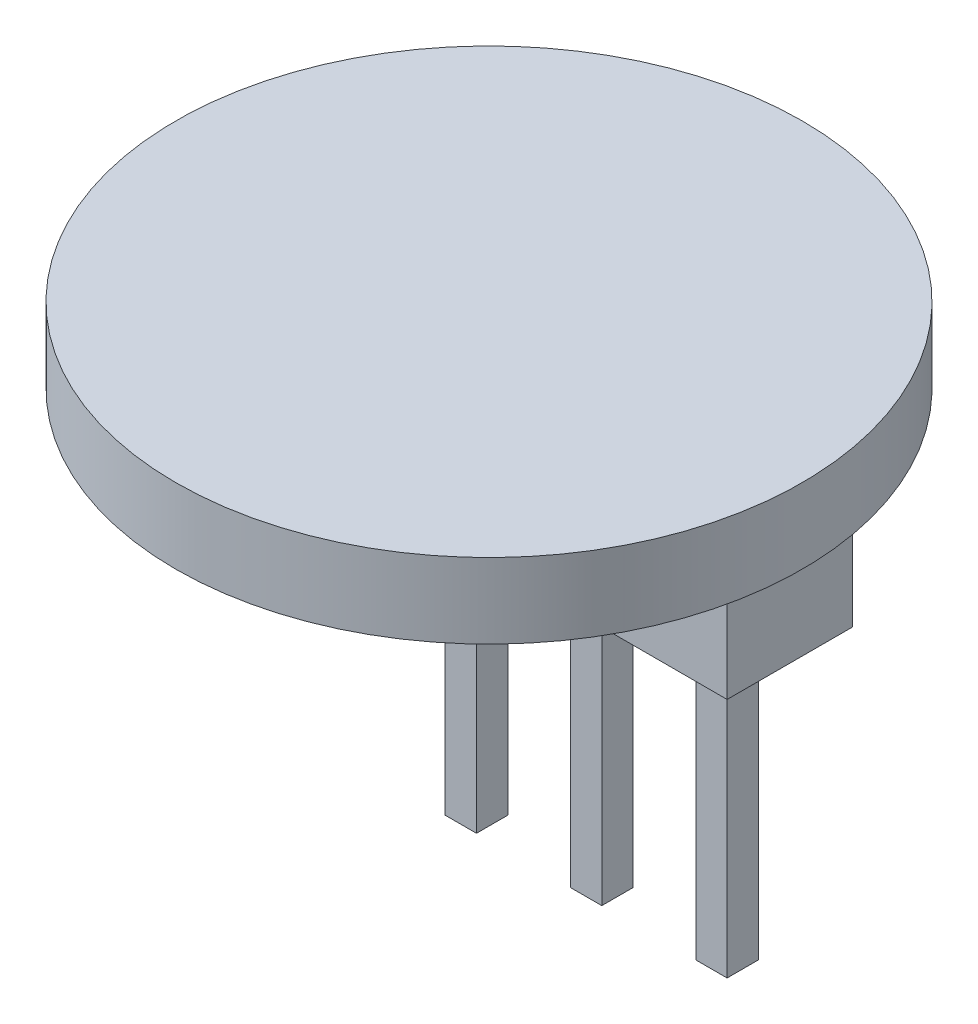
ISO-10303-21;
HEADER;
FILE_DESCRIPTION(('STEP AP214'),'2;1');
FILE_NAME('part.step','',(''),(''),'','','');
FILE_SCHEMA(('AUTOMOTIVE_DESIGN { 1 0 10303 214 1 1 1 1 }'));
ENDSEC;
DATA;
#1=APPLICATION_CONTEXT('core data for automotive mechanical design processes');
#2=APPLICATION_PROTOCOL_DEFINITION('international standard','automotive_design',2000,#1);
#3=PRODUCT_CONTEXT('',#1,'mechanical');
#4=PRODUCT('Part','Part','',(#3));
#5=PRODUCT_RELATED_PRODUCT_CATEGORY('part','',(#4));
#6=PRODUCT_DEFINITION_FORMATION('','',#4);
#7=PRODUCT_DEFINITION_CONTEXT('part definition',#1,'design');
#8=PRODUCT_DEFINITION('design','',#6,#7);
#9=PRODUCT_DEFINITION_SHAPE('','',#8);
#10=(LENGTH_UNIT() NAMED_UNIT(*) SI_UNIT(.MILLI.,.METRE.));
#11=(NAMED_UNIT(*) PLANE_ANGLE_UNIT() SI_UNIT($,.RADIAN.));
#12=(NAMED_UNIT(*) SI_UNIT($,.STERADIAN.) SOLID_ANGLE_UNIT());
#13=UNCERTAINTY_MEASURE_WITH_UNIT(LENGTH_MEASURE(1.E-05),#10,'distance_accuracy_value','');
#14=(GEOMETRIC_REPRESENTATION_CONTEXT(3) GLOBAL_UNCERTAINTY_ASSIGNED_CONTEXT((#13)) GLOBAL_UNIT_ASSIGNED_CONTEXT((#10,
#11,#12)) REPRESENTATION_CONTEXT('',''));
#15=CARTESIAN_POINT('',(0.,0.,0.));
#16=DIRECTION('',(0.,0.,1.));
#17=DIRECTION('',(1.,0.,0.));
#18=AXIS2_PLACEMENT_3D('',#15,#16,#17);
#19=CARTESIAN_POINT('',(0.,-5.584,0.));
#20=DIRECTION('',(0.,-1.,0.));
#21=DIRECTION('',(0.,0.,-1.));
#22=AXIS2_PLACEMENT_3D('',#19,#20,#21);
#23=PLANE('',#22);
#24=DIRECTION('',(-1.,0.,0.));
#25=VECTOR('',#24,1.);
#26=CARTESIAN_POINT('',(-0.317500000000001,-5.584,-1.9685));
#27=LINE('',#26,#25);
#28=CARTESIAN_POINT('',(0.3175,-5.584,-1.9685));
#29=VERTEX_POINT('',#28);
#30=CARTESIAN_POINT('',(-0.317500000000001,-5.584,-1.9685));
#31=VERTEX_POINT('',#30);
#32=EDGE_CURVE('E175',#29,#31,#27,.T.);
#33=ORIENTED_EDGE('',*,*,#32,.F.);
#34=DIRECTION('',(0.,0.,1.));
#35=VECTOR('',#34,1.);
#36=CARTESIAN_POINT('',(0.3175,-5.584,-2.6035));
#37=LINE('',#36,#35);
#38=CARTESIAN_POINT('',(0.3175,-5.584,-2.6035));
#39=VERTEX_POINT('',#38);
#40=EDGE_CURVE('E172',#39,#29,#37,.T.);
#41=ORIENTED_EDGE('',*,*,#40,.F.);
#42=DIRECTION('',(1.,0.,0.));
#43=VECTOR('',#42,1.);
#44=CARTESIAN_POINT('',(-0.317500000000001,-5.584,-2.6035));
#45=LINE('',#44,#43);
#46=CARTESIAN_POINT('',(-0.317500000000001,-5.584,-2.6035));
#47=VERTEX_POINT('',#46);
#48=EDGE_CURVE('E184',#47,#39,#45,.T.);
#49=ORIENTED_EDGE('',*,*,#48,.F.);
#50=DIRECTION('',(0.,0.,-1.));
#51=VECTOR('',#50,1.);
#52=CARTESIAN_POINT('',(-0.317500000000001,-5.584,-2.6035));
#53=LINE('',#52,#51);
#54=EDGE_CURVE('E192',#31,#47,#53,.T.);
#55=ORIENTED_EDGE('',*,*,#54,.F.);
#56=EDGE_LOOP('',(#33,#41,#49,#55));
#57=FACE_BOUND('',#56,.T.);
#58=DIRECTION('',(0.,0.,-1.));
#59=VECTOR('',#58,1.);
#60=CARTESIAN_POINT('',(-3.81,-5.584,-3.556));
#61=LINE('',#60,#59);
#62=CARTESIAN_POINT('',(-3.81,-5.584,-1.016));
#63=VERTEX_POINT('',#62);
#64=CARTESIAN_POINT('',(-3.81,-5.584,-3.556));
#65=VERTEX_POINT('',#64);
#66=EDGE_CURVE('E233',#63,#65,#61,.T.);
#67=ORIENTED_EDGE('',*,*,#66,.T.);
#68=DIRECTION('',(1.,0.,0.));
#69=VECTOR('',#68,1.);
#70=CARTESIAN_POINT('',(3.81,-5.584,-3.556));
#71=LINE('',#70,#69);
#72=CARTESIAN_POINT('',(3.81,-5.584,-3.556));
#73=VERTEX_POINT('',#72);
#74=EDGE_CURVE('E236',#65,#73,#71,.T.);
#75=ORIENTED_EDGE('',*,*,#74,.T.);
#76=DIRECTION('',(0.,0.,1.));
#77=VECTOR('',#76,1.);
#78=CARTESIAN_POINT('',(3.81,-5.584,-3.556));
#79=LINE('',#78,#77);
#80=CARTESIAN_POINT('',(3.81,-5.584,-1.016));
#81=VERTEX_POINT('',#80);
#82=EDGE_CURVE('E239',#73,#81,#79,.T.);
#83=ORIENTED_EDGE('',*,*,#82,.T.);
#84=DIRECTION('',(-1.,0.,0.));
#85=VECTOR('',#84,1.);
#86=CARTESIAN_POINT('',(3.81,-5.584,-1.016));
#87=LINE('',#86,#85);
#88=EDGE_CURVE('E241',#81,#63,#87,.T.);
#89=ORIENTED_EDGE('',*,*,#88,.T.);
#90=EDGE_LOOP('',(#67,#75,#83,#89));
#91=FACE_BOUND('',#90,.T.);
#92=DIRECTION('',(-1.,0.,0.));
#93=VECTOR('',#92,1.);
#94=CARTESIAN_POINT('',(-2.8575,-5.584,-1.9685));
#95=LINE('',#94,#93);
#96=CARTESIAN_POINT('',(-2.2225,-5.584,-1.9685));
#97=VERTEX_POINT('',#96);
#98=CARTESIAN_POINT('',(-2.8575,-5.584,-1.9685));
#99=VERTEX_POINT('',#98);
#100=EDGE_CURVE('E217',#97,#99,#95,.T.);
#101=ORIENTED_EDGE('',*,*,#100,.F.);
#102=DIRECTION('',(0.,0.,1.));
#103=VECTOR('',#102,1.);
#104=CARTESIAN_POINT('',(-2.2225,-5.584,-2.6035));
#105=LINE('',#104,#103);
#106=CARTESIAN_POINT('',(-2.2225,-5.584,-2.6035));
#107=VERTEX_POINT('',#106);
#108=EDGE_CURVE('E203',#107,#97,#105,.T.);
#109=ORIENTED_EDGE('',*,*,#108,.F.);
#110=DIRECTION('',(1.,0.,0.));
#111=VECTOR('',#110,1.);
#112=CARTESIAN_POINT('',(-2.8575,-5.584,-2.6035));
#113=LINE('',#112,#111);
#114=CARTESIAN_POINT('',(-2.8575,-5.584,-2.6035));
#115=VERTEX_POINT('',#114);
#116=EDGE_CURVE('E208',#115,#107,#113,.T.);
#117=ORIENTED_EDGE('',*,*,#116,.F.);
#118=DIRECTION('',(0.,0.,-1.));
#119=VECTOR('',#118,1.);
#120=CARTESIAN_POINT('',(-2.8575,-5.584,-2.6035));
#121=LINE('',#120,#119);
#122=EDGE_CURVE('E219',#99,#115,#121,.T.);
#123=ORIENTED_EDGE('',*,*,#122,.F.);
#124=EDGE_LOOP('',(#101,#109,#117,#123));
#125=FACE_BOUND('',#124,.T.);
#126=DIRECTION('',(-1.,0.,0.));
#127=VECTOR('',#126,1.);
#128=CARTESIAN_POINT('',(2.2225,-5.584,-1.9685));
#129=LINE('',#128,#127);
#130=CARTESIAN_POINT('',(2.8575,-5.584,-1.9685));
#131=VERTEX_POINT('',#130);
#132=CARTESIAN_POINT('',(2.2225,-5.584,-1.9685));
#133=VERTEX_POINT('',#132);
#134=EDGE_CURVE('E321',#131,#133,#129,.T.);
#135=ORIENTED_EDGE('',*,*,#134,.F.);
#136=DIRECTION('',(0.,0.,1.));
#137=VECTOR('',#136,1.);
#138=CARTESIAN_POINT('',(2.8575,-5.584,-2.6035));
#139=LINE('',#138,#137);
#140=CARTESIAN_POINT('',(2.8575,-5.584,-2.6035));
#141=VERTEX_POINT('',#140);
#142=EDGE_CURVE('E170',#141,#131,#139,.T.);
#143=ORIENTED_EDGE('',*,*,#142,.F.);
#144=DIRECTION('',(1.,0.,0.));
#145=VECTOR('',#144,1.);
#146=CARTESIAN_POINT('',(2.2225,-5.584,-2.6035));
#147=LINE('',#146,#145);
#148=CARTESIAN_POINT('',(2.2225,-5.584,-2.6035));
#149=VERTEX_POINT('',#148);
#150=EDGE_CURVE('E166',#149,#141,#147,.T.);
#151=ORIENTED_EDGE('',*,*,#150,.F.);
#152=DIRECTION('',(0.,0.,-1.));
#153=VECTOR('',#152,1.);
#154=CARTESIAN_POINT('',(2.2225,-5.584,-2.6035));
#155=LINE('',#154,#153);
#156=EDGE_CURVE('E323',#133,#149,#155,.T.);
#157=ORIENTED_EDGE('',*,*,#156,.F.);
#158=EDGE_LOOP('',(#135,#143,#151,#157));
#159=FACE_BOUND('',#158,.T.);
#160=ADVANCED_FACE('F33',(#57,#91,#125,#159),#23,.T.);
#161=CARTESIAN_POINT('',(0.,-1.52,0.));
#162=DIRECTION('',(0.,1.,0.));
#163=DIRECTION('',(0.,0.,1.));
#164=AXIS2_PLACEMENT_3D('',#161,#162,#163);
#165=PLANE('',#164);
#166=CARTESIAN_POINT('',(0.,-1.52,0.));
#167=DIRECTION('',(0.,1.,0.));
#168=DIRECTION('',(0.,0.,1.));
#169=AXIS2_PLACEMENT_3D('',#166,#167,#168);
#170=CIRCLE('',#169,6.35);
#171=CARTESIAN_POINT('',(0.,-1.52,6.35));
#172=VERTEX_POINT('',#171);
#173=EDGE_CURVE('E11',#172,#172,#170,.T.);
#174=ORIENTED_EDGE('',*,*,#173,.F.);
#175=EDGE_LOOP('',(#174));
#176=FACE_BOUND('',#175,.T.);
#177=DIRECTION('',(0.,0.,-1.));
#178=VECTOR('',#177,1.);
#179=CARTESIAN_POINT('',(-3.81,-1.52,-3.556));
#180=LINE('',#179,#178);
#181=CARTESIAN_POINT('',(-3.81,-1.52,-1.016));
#182=VERTEX_POINT('',#181);
#183=CARTESIAN_POINT('',(-3.81,-1.52,-3.556));
#184=VERTEX_POINT('',#183);
#185=EDGE_CURVE('E232',#182,#184,#180,.T.);
#186=ORIENTED_EDGE('',*,*,#185,.F.);
#187=DIRECTION('',(-1.,0.,0.));
#188=VECTOR('',#187,1.);
#189=CARTESIAN_POINT('',(3.81,-1.52,-1.016));
#190=LINE('',#189,#188);
#191=CARTESIAN_POINT('',(3.81,-1.52,-1.016));
#192=VERTEX_POINT('',#191);
#193=EDGE_CURVE('E237',#192,#182,#190,.T.);
#194=ORIENTED_EDGE('',*,*,#193,.F.);
#195=DIRECTION('',(0.,0.,1.));
#196=VECTOR('',#195,1.);
#197=CARTESIAN_POINT('',(3.81,-1.52,-3.556));
#198=LINE('',#197,#196);
#199=CARTESIAN_POINT('',(3.81,-1.52,-3.556));
#200=VERTEX_POINT('',#199);
#201=EDGE_CURVE('E249',#200,#192,#198,.T.);
#202=ORIENTED_EDGE('',*,*,#201,.F.);
#203=DIRECTION('',(1.,0.,0.));
#204=VECTOR('',#203,1.);
#205=CARTESIAN_POINT('',(3.81,-1.52,-3.556));
#206=LINE('',#205,#204);
#207=EDGE_CURVE('E246',#184,#200,#206,.T.);
#208=ORIENTED_EDGE('',*,*,#207,.F.);
#209=EDGE_LOOP('',(#186,#194,#202,#208));
#210=FACE_BOUND('',#209,.T.);
#211=ADVANCED_FACE('F272',(#176,#210),#165,.F.);
#212=CARTESIAN_POINT('',(0.,-1.52,0.));
#213=DIRECTION('',(0.,1.,0.));
#214=DIRECTION('',(0.,0.,1.));
#215=AXIS2_PLACEMENT_3D('',#212,#213,#214);
#216=CYLINDRICAL_SURFACE('',#215,6.35);
#217=ORIENTED_EDGE('',*,*,#173,.T.);
#218=EDGE_LOOP('',(#217));
#219=FACE_BOUND('',#218,.T.);
#220=CARTESIAN_POINT('',(0.,0.,0.));
#221=DIRECTION('',(0.,1.,0.));
#222=DIRECTION('',(0.,0.,1.));
#223=AXIS2_PLACEMENT_3D('',#220,#221,#222);
#224=CIRCLE('',#223,6.35);
#225=CARTESIAN_POINT('',(0.,0.,6.35));
#226=VERTEX_POINT('',#225);
#227=EDGE_CURVE('E37',#226,#226,#224,.T.);
#228=ORIENTED_EDGE('',*,*,#227,.F.);
#229=EDGE_LOOP('',(#228));
#230=FACE_BOUND('',#229,.T.);
#231=ADVANCED_FACE('F35',(#219,#230),#216,.T.);
#232=CARTESIAN_POINT('',(0.,0.,0.));
#233=DIRECTION('',(0.,1.,0.));
#234=DIRECTION('',(0.,0.,1.));
#235=AXIS2_PLACEMENT_3D('',#232,#233,#234);
#236=PLANE('',#235);
#237=ORIENTED_EDGE('',*,*,#227,.T.);
#238=EDGE_LOOP('',(#237));
#239=FACE_BOUND('',#238,.T.);
#240=ADVANCED_FACE('F269',(#239),#236,.T.);
#241=CARTESIAN_POINT('',(-3.81,-5.584,-3.556));
#242=DIRECTION('',(1.,0.,0.));
#243=DIRECTION('',(0.,0.,-1.));
#244=AXIS2_PLACEMENT_3D('',#241,#242,#243);
#245=PLANE('',#244);
#246=ORIENTED_EDGE('',*,*,#185,.T.);
#247=DIRECTION('',(0.,1.,0.));
#248=VECTOR('',#247,1.);
#249=CARTESIAN_POINT('',(-3.81,-5.584,-3.556));
#250=LINE('',#249,#248);
#251=EDGE_CURVE('E262',#65,#184,#250,.T.);
#252=ORIENTED_EDGE('',*,*,#251,.F.);
#253=ORIENTED_EDGE('',*,*,#66,.F.);
#254=DIRECTION('',(0.,1.,0.));
#255=VECTOR('',#254,1.);
#256=CARTESIAN_POINT('',(-3.81,-5.584,-1.016));
#257=LINE('',#256,#255);
#258=EDGE_CURVE('E243',#63,#182,#257,.T.);
#259=ORIENTED_EDGE('',*,*,#258,.T.);
#260=EDGE_LOOP('',(#246,#252,#253,#259));
#261=FACE_BOUND('',#260,.T.);
#262=ADVANCED_FACE('F277',(#261),#245,.F.);
#263=CARTESIAN_POINT('',(3.81,-5.584,-3.556));
#264=DIRECTION('',(0.,0.,1.));
#265=DIRECTION('',(1.,0.,0.));
#266=AXIS2_PLACEMENT_3D('',#263,#264,#265);
#267=PLANE('',#266);
#268=ORIENTED_EDGE('',*,*,#207,.T.);
#269=DIRECTION('',(0.,1.,0.));
#270=VECTOR('',#269,1.);
#271=CARTESIAN_POINT('',(3.81,-5.584,-3.556));
#272=LINE('',#271,#270);
#273=EDGE_CURVE('E259',#73,#200,#272,.T.);
#274=ORIENTED_EDGE('',*,*,#273,.F.);
#275=ORIENTED_EDGE('',*,*,#74,.F.);
#276=ORIENTED_EDGE('',*,*,#251,.T.);
#277=EDGE_LOOP('',(#268,#274,#275,#276));
#278=FACE_BOUND('',#277,.T.);
#279=ADVANCED_FACE('F301',(#278),#267,.F.);
#280=CARTESIAN_POINT('',(3.81,-5.584,-3.556));
#281=DIRECTION('',(-1.,0.,0.));
#282=DIRECTION('',(0.,0.,1.));
#283=AXIS2_PLACEMENT_3D('',#280,#281,#282);
#284=PLANE('',#283);
#285=ORIENTED_EDGE('',*,*,#201,.T.);
#286=DIRECTION('',(0.,1.,0.));
#287=VECTOR('',#286,1.);
#288=CARTESIAN_POINT('',(3.81,-5.584,-1.016));
#289=LINE('',#288,#287);
#290=EDGE_CURVE('E256',#81,#192,#289,.T.);
#291=ORIENTED_EDGE('',*,*,#290,.F.);
#292=ORIENTED_EDGE('',*,*,#82,.F.);
#293=ORIENTED_EDGE('',*,*,#273,.T.);
#294=EDGE_LOOP('',(#285,#291,#292,#293));
#295=FACE_BOUND('',#294,.T.);
#296=ADVANCED_FACE('F297',(#295),#284,.F.);
#297=CARTESIAN_POINT('',(3.81,-5.584,-1.016));
#298=DIRECTION('',(0.,0.,-1.));
#299=DIRECTION('',(-1.,0.,0.));
#300=AXIS2_PLACEMENT_3D('',#297,#298,#299);
#301=PLANE('',#300);
#302=ORIENTED_EDGE('',*,*,#193,.T.);
#303=ORIENTED_EDGE('',*,*,#258,.F.);
#304=ORIENTED_EDGE('',*,*,#88,.F.);
#305=ORIENTED_EDGE('',*,*,#290,.T.);
#306=EDGE_LOOP('',(#302,#303,#304,#305));
#307=FACE_BOUND('',#306,.T.);
#308=ADVANCED_FACE('F294',(#307),#301,.F.);
#309=CARTESIAN_POINT('',(-2.2225,-11.426,-2.6035));
#310=DIRECTION('',(-1.,0.,0.));
#311=DIRECTION('',(0.,0.,1.));
#312=AXIS2_PLACEMENT_3D('',#309,#310,#311);
#313=PLANE('',#312);
#314=ORIENTED_EDGE('',*,*,#108,.T.);
#315=DIRECTION('',(0.,1.,0.));
#316=VECTOR('',#315,1.);
#317=CARTESIAN_POINT('',(-2.2225,-11.426,-1.9685));
#318=LINE('',#317,#316);
#319=CARTESIAN_POINT('',(-2.2225,-11.426,-1.9685));
#320=VERTEX_POINT('',#319);
#321=EDGE_CURVE('E230',#320,#97,#318,.T.);
#322=ORIENTED_EDGE('',*,*,#321,.F.);
#323=DIRECTION('',(0.,0.,1.));
#324=VECTOR('',#323,1.);
#325=CARTESIAN_POINT('',(-2.2225,-11.426,-2.6035));
#326=LINE('',#325,#324);
#327=CARTESIAN_POINT('',(-2.2225,-11.426,-2.6035));
#328=VERTEX_POINT('',#327);
#329=EDGE_CURVE('E204',#328,#320,#326,.T.);
#330=ORIENTED_EDGE('',*,*,#329,.F.);
#331=DIRECTION('',(0.,1.,0.));
#332=VECTOR('',#331,1.);
#333=CARTESIAN_POINT('',(-2.2225,-11.426,-2.6035));
#334=LINE('',#333,#332);
#335=EDGE_CURVE('E214',#328,#107,#334,.T.);
#336=ORIENTED_EDGE('',*,*,#335,.T.);
#337=EDGE_LOOP('',(#314,#322,#330,#336));
#338=FACE_BOUND('',#337,.T.);
#339=ADVANCED_FACE('F292',(#338),#313,.F.);
#340=CARTESIAN_POINT('',(-2.8575,-11.426,-1.9685));
#341=DIRECTION('',(0.,0.,-1.));
#342=DIRECTION('',(-1.,0.,0.));
#343=AXIS2_PLACEMENT_3D('',#340,#341,#342);
#344=PLANE('',#343);
#345=ORIENTED_EDGE('',*,*,#100,.T.);
#346=DIRECTION('',(0.,1.,0.));
#347=VECTOR('',#346,1.);
#348=CARTESIAN_POINT('',(-2.8575,-11.426,-1.9685));
#349=LINE('',#348,#347);
#350=CARTESIAN_POINT('',(-2.8575,-11.426,-1.9685));
#351=VERTEX_POINT('',#350);
#352=EDGE_CURVE('E227',#351,#99,#349,.T.);
#353=ORIENTED_EDGE('',*,*,#352,.F.);
#354=DIRECTION('',(-1.,0.,0.));
#355=VECTOR('',#354,1.);
#356=CARTESIAN_POINT('',(-2.8575,-11.426,-1.9685));
#357=LINE('',#356,#355);
#358=EDGE_CURVE('E207',#320,#351,#357,.T.);
#359=ORIENTED_EDGE('',*,*,#358,.F.);
#360=ORIENTED_EDGE('',*,*,#321,.T.);
#361=EDGE_LOOP('',(#345,#353,#359,#360));
#362=FACE_BOUND('',#361,.T.);
#363=ADVANCED_FACE('F377',(#362),#344,.F.);
#364=CARTESIAN_POINT('',(-2.8575,-11.426,-2.6035));
#365=DIRECTION('',(1.,0.,0.));
#366=DIRECTION('',(0.,0.,-1.));
#367=AXIS2_PLACEMENT_3D('',#364,#365,#366);
#368=PLANE('',#367);
#369=ORIENTED_EDGE('',*,*,#122,.T.);
#370=DIRECTION('',(0.,1.,0.));
#371=VECTOR('',#370,1.);
#372=CARTESIAN_POINT('',(-2.8575,-11.426,-2.6035));
#373=LINE('',#372,#371);
#374=CARTESIAN_POINT('',(-2.8575,-11.426,-2.6035));
#375=VERTEX_POINT('',#374);
#376=EDGE_CURVE('E225',#375,#115,#373,.T.);
#377=ORIENTED_EDGE('',*,*,#376,.F.);
#378=DIRECTION('',(0.,0.,-1.));
#379=VECTOR('',#378,1.);
#380=CARTESIAN_POINT('',(-2.8575,-11.426,-2.6035));
#381=LINE('',#380,#379);
#382=EDGE_CURVE('E210',#351,#375,#381,.T.);
#383=ORIENTED_EDGE('',*,*,#382,.F.);
#384=ORIENTED_EDGE('',*,*,#352,.T.);
#385=EDGE_LOOP('',(#369,#377,#383,#384));
#386=FACE_BOUND('',#385,.T.);
#387=ADVANCED_FACE('F374',(#386),#368,.F.);
#388=CARTESIAN_POINT('',(-2.8575,-11.426,-2.6035));
#389=DIRECTION('',(0.,0.,1.));
#390=DIRECTION('',(1.,0.,0.));
#391=AXIS2_PLACEMENT_3D('',#388,#389,#390);
#392=PLANE('',#391);
#393=ORIENTED_EDGE('',*,*,#116,.T.);
#394=ORIENTED_EDGE('',*,*,#335,.F.);
#395=DIRECTION('',(1.,0.,0.));
#396=VECTOR('',#395,1.);
#397=CARTESIAN_POINT('',(-2.8575,-11.426,-2.6035));
#398=LINE('',#397,#396);
#399=EDGE_CURVE('E212',#375,#328,#398,.T.);
#400=ORIENTED_EDGE('',*,*,#399,.F.);
#401=ORIENTED_EDGE('',*,*,#376,.T.);
#402=EDGE_LOOP('',(#393,#394,#400,#401));
#403=FACE_BOUND('',#402,.T.);
#404=ADVANCED_FACE('F370',(#403),#392,.F.);
#405=CARTESIAN_POINT('',(0.,-11.426,0.));
#406=DIRECTION('',(0.,1.,0.));
#407=DIRECTION('',(0.,0.,1.));
#408=AXIS2_PLACEMENT_3D('',#405,#406,#407);
#409=PLANE('',#408);
#410=ORIENTED_EDGE('',*,*,#329,.T.);
#411=ORIENTED_EDGE('',*,*,#358,.T.);
#412=ORIENTED_EDGE('',*,*,#382,.T.);
#413=ORIENTED_EDGE('',*,*,#399,.T.);
#414=EDGE_LOOP('',(#410,#411,#412,#413));
#415=FACE_BOUND('',#414,.T.);
#416=ADVANCED_FACE('F366',(#415),#409,.F.);
#417=CARTESIAN_POINT('',(0.3175,-11.426,-2.6035));
#418=DIRECTION('',(-1.,0.,0.));
#419=DIRECTION('',(0.,0.,1.));
#420=AXIS2_PLACEMENT_3D('',#417,#418,#419);
#421=PLANE('',#420);
#422=ORIENTED_EDGE('',*,*,#40,.T.);
#423=DIRECTION('',(0.,1.,0.));
#424=VECTOR('',#423,1.);
#425=CARTESIAN_POINT('',(0.3175,-11.426,-1.9685));
#426=LINE('',#425,#424);
#427=CARTESIAN_POINT('',(0.3175,-11.426,-1.9685));
#428=VERTEX_POINT('',#427);
#429=EDGE_CURVE('E201',#428,#29,#426,.T.);
#430=ORIENTED_EDGE('',*,*,#429,.F.);
#431=DIRECTION('',(0.,0.,1.));
#432=VECTOR('',#431,1.);
#433=CARTESIAN_POINT('',(0.3175,-11.426,-2.6035));
#434=LINE('',#433,#432);
#435=CARTESIAN_POINT('',(0.3175,-11.426,-2.6035));
#436=VERTEX_POINT('',#435);
#437=EDGE_CURVE('E180',#436,#428,#434,.T.);
#438=ORIENTED_EDGE('',*,*,#437,.F.);
#439=DIRECTION('',(0.,1.,0.));
#440=VECTOR('',#439,1.);
#441=CARTESIAN_POINT('',(0.3175,-11.426,-2.6035));
#442=LINE('',#441,#440);
#443=EDGE_CURVE('E189',#436,#39,#442,.T.);
#444=ORIENTED_EDGE('',*,*,#443,.T.);
#445=EDGE_LOOP('',(#422,#430,#438,#444));
#446=FACE_BOUND('',#445,.T.);
#447=ADVANCED_FACE('F362',(#446),#421,.F.);
#448=CARTESIAN_POINT('',(-0.317500000000001,-11.426,-1.9685));
#449=DIRECTION('',(0.,0.,-1.));
#450=DIRECTION('',(-1.,0.,0.));
#451=AXIS2_PLACEMENT_3D('',#448,#449,#450);
#452=PLANE('',#451);
#453=ORIENTED_EDGE('',*,*,#32,.T.);
#454=DIRECTION('',(0.,1.,0.));
#455=VECTOR('',#454,1.);
#456=CARTESIAN_POINT('',(-0.317500000000001,-11.426,-1.9685));
#457=LINE('',#456,#455);
#458=CARTESIAN_POINT('',(-0.317500000000001,-11.426,-1.9685));
#459=VERTEX_POINT('',#458);
#460=EDGE_CURVE('E198',#459,#31,#457,.T.);
#461=ORIENTED_EDGE('',*,*,#460,.F.);
#462=DIRECTION('',(-1.,0.,0.));
#463=VECTOR('',#462,1.);
#464=CARTESIAN_POINT('',(-0.317500000000001,-11.426,-1.9685));
#465=LINE('',#464,#463);
#466=EDGE_CURVE('E183',#428,#459,#465,.T.);
#467=ORIENTED_EDGE('',*,*,#466,.F.);
#468=ORIENTED_EDGE('',*,*,#429,.T.);
#469=EDGE_LOOP('',(#453,#461,#467,#468));
#470=FACE_BOUND('',#469,.T.);
#471=ADVANCED_FACE('F358',(#470),#452,.F.);
#472=CARTESIAN_POINT('',(-0.317500000000001,-11.426,-2.6035));
#473=DIRECTION('',(1.,0.,0.));
#474=DIRECTION('',(0.,0.,-1.));
#475=AXIS2_PLACEMENT_3D('',#472,#473,#474);
#476=PLANE('',#475);
#477=ORIENTED_EDGE('',*,*,#54,.T.);
#478=DIRECTION('',(0.,1.,0.));
#479=VECTOR('',#478,1.);
#480=CARTESIAN_POINT('',(-0.317500000000001,-11.426,-2.6035));
#481=LINE('',#480,#479);
#482=CARTESIAN_POINT('',(-0.317500000000001,-11.426,-2.6035));
#483=VERTEX_POINT('',#482);
#484=EDGE_CURVE('E56',#483,#47,#481,.T.);
#485=ORIENTED_EDGE('',*,*,#484,.F.);
#486=DIRECTION('',(0.,0.,-1.));
#487=VECTOR('',#486,1.);
#488=CARTESIAN_POINT('',(-0.317500000000001,-11.426,-2.6035));
#489=LINE('',#488,#487);
#490=EDGE_CURVE('E186',#459,#483,#489,.T.);
#491=ORIENTED_EDGE('',*,*,#490,.F.);
#492=ORIENTED_EDGE('',*,*,#460,.T.);
#493=EDGE_LOOP('',(#477,#485,#491,#492));
#494=FACE_BOUND('',#493,.T.);
#495=ADVANCED_FACE('F355',(#494),#476,.F.);
#496=CARTESIAN_POINT('',(-0.317500000000001,-11.426,-2.6035));
#497=DIRECTION('',(0.,0.,1.));
#498=DIRECTION('',(1.,0.,0.));
#499=AXIS2_PLACEMENT_3D('',#496,#497,#498);
#500=PLANE('',#499);
#501=ORIENTED_EDGE('',*,*,#48,.T.);
#502=ORIENTED_EDGE('',*,*,#443,.F.);
#503=DIRECTION('',(1.,0.,0.));
#504=VECTOR('',#503,1.);
#505=CARTESIAN_POINT('',(-0.317500000000001,-11.426,-2.6035));
#506=LINE('',#505,#504);
#507=EDGE_CURVE('E188',#483,#436,#506,.T.);
#508=ORIENTED_EDGE('',*,*,#507,.F.);
#509=ORIENTED_EDGE('',*,*,#484,.T.);
#510=EDGE_LOOP('',(#501,#502,#508,#509));
#511=FACE_BOUND('',#510,.T.);
#512=ADVANCED_FACE('F351',(#511),#500,.F.);
#513=CARTESIAN_POINT('',(0.,-11.426,0.));
#514=DIRECTION('',(0.,1.,0.));
#515=DIRECTION('',(0.,0.,1.));
#516=AXIS2_PLACEMENT_3D('',#513,#514,#515);
#517=PLANE('',#516);
#518=ORIENTED_EDGE('',*,*,#437,.T.);
#519=ORIENTED_EDGE('',*,*,#466,.T.);
#520=ORIENTED_EDGE('',*,*,#490,.T.);
#521=ORIENTED_EDGE('',*,*,#507,.T.);
#522=EDGE_LOOP('',(#518,#519,#520,#521));
#523=FACE_BOUND('',#522,.T.);
#524=ADVANCED_FACE('F348',(#523),#517,.F.);
#525=CARTESIAN_POINT('',(2.8575,-11.426,-2.6035));
#526=DIRECTION('',(-1.,0.,0.));
#527=DIRECTION('',(0.,0.,1.));
#528=AXIS2_PLACEMENT_3D('',#525,#526,#527);
#529=PLANE('',#528);
#530=ORIENTED_EDGE('',*,*,#142,.T.);
#531=DIRECTION('',(0.,1.,0.));
#532=VECTOR('',#531,1.);
#533=CARTESIAN_POINT('',(2.8575,-11.426,-1.9685));
#534=LINE('',#533,#532);
#535=CARTESIAN_POINT('',(2.8575,-11.426,-1.9685));
#536=VERTEX_POINT('',#535);
#537=EDGE_CURVE('E151',#536,#131,#534,.T.);
#538=ORIENTED_EDGE('',*,*,#537,.F.);
#539=DIRECTION('',(0.,0.,1.));
#540=VECTOR('',#539,1.);
#541=CARTESIAN_POINT('',(2.8575,-11.426,-2.6035));
#542=LINE('',#541,#540);
#543=CARTESIAN_POINT('',(2.8575,-11.426,-2.6035));
#544=VERTEX_POINT('',#543);
#545=EDGE_CURVE('E158',#544,#536,#542,.T.);
#546=ORIENTED_EDGE('',*,*,#545,.F.);
#547=DIRECTION('',(0.,1.,0.));
#548=VECTOR('',#547,1.);
#549=CARTESIAN_POINT('',(2.8575,-11.426,-2.6035));
#550=LINE('',#549,#548);
#551=EDGE_CURVE('E330',#544,#141,#550,.T.);
#552=ORIENTED_EDGE('',*,*,#551,.T.);
#553=EDGE_LOOP('',(#530,#538,#546,#552));
#554=FACE_BOUND('',#553,.T.);
#555=ADVANCED_FACE('F168',(#554),#529,.F.);
#556=CARTESIAN_POINT('',(2.2225,-11.426,-1.9685));
#557=DIRECTION('',(0.,0.,-1.));
#558=DIRECTION('',(-1.,0.,0.));
#559=AXIS2_PLACEMENT_3D('',#556,#557,#558);
#560=PLANE('',#559);
#561=ORIENTED_EDGE('',*,*,#134,.T.);
#562=DIRECTION('',(0.,1.,0.));
#563=VECTOR('',#562,1.);
#564=CARTESIAN_POINT('',(2.2225,-11.426,-1.9685));
#565=LINE('',#564,#563);
#566=CARTESIAN_POINT('',(2.2225,-11.426,-1.9685));
#567=VERTEX_POINT('',#566);
#568=EDGE_CURVE('E154',#567,#133,#565,.T.);
#569=ORIENTED_EDGE('',*,*,#568,.F.);
#570=DIRECTION('',(-1.,0.,0.));
#571=VECTOR('',#570,1.);
#572=CARTESIAN_POINT('',(2.2225,-11.426,-1.9685));
#573=LINE('',#572,#571);
#574=EDGE_CURVE('E147',#536,#567,#573,.T.);
#575=ORIENTED_EDGE('',*,*,#574,.F.);
#576=ORIENTED_EDGE('',*,*,#537,.T.);
#577=EDGE_LOOP('',(#561,#569,#575,#576));
#578=FACE_BOUND('',#577,.T.);
#579=ADVANCED_FACE('F149',(#578),#560,.F.);
#580=CARTESIAN_POINT('',(2.2225,-11.426,-2.6035));
#581=DIRECTION('',(1.,0.,0.));
#582=DIRECTION('',(0.,0.,-1.));
#583=AXIS2_PLACEMENT_3D('',#580,#581,#582);
#584=PLANE('',#583);
#585=ORIENTED_EDGE('',*,*,#156,.T.);
#586=DIRECTION('',(0.,1.,0.));
#587=VECTOR('',#586,1.);
#588=CARTESIAN_POINT('',(2.2225,-11.426,-2.6035));
#589=LINE('',#588,#587);
#590=CARTESIAN_POINT('',(2.2225,-11.426,-2.6035));
#591=VERTEX_POINT('',#590);
#592=EDGE_CURVE('E48',#591,#149,#589,.T.);
#593=ORIENTED_EDGE('',*,*,#592,.F.);
#594=DIRECTION('',(0.,0.,-1.));
#595=VECTOR('',#594,1.);
#596=CARTESIAN_POINT('',(2.2225,-11.426,-2.6035));
#597=LINE('',#596,#595);
#598=EDGE_CURVE('E157',#567,#591,#597,.T.);
#599=ORIENTED_EDGE('',*,*,#598,.F.);
#600=ORIENTED_EDGE('',*,*,#568,.T.);
#601=EDGE_LOOP('',(#585,#593,#599,#600));
#602=FACE_BOUND('',#601,.T.);
#603=ADVANCED_FACE('F333',(#602),#584,.F.);
#604=CARTESIAN_POINT('',(2.2225,-11.426,-2.6035));
#605=DIRECTION('',(0.,0.,1.));
#606=DIRECTION('',(1.,0.,0.));
#607=AXIS2_PLACEMENT_3D('',#604,#605,#606);
#608=PLANE('',#607);
#609=ORIENTED_EDGE('',*,*,#150,.T.);
#610=ORIENTED_EDGE('',*,*,#551,.F.);
#611=DIRECTION('',(1.,0.,0.));
#612=VECTOR('',#611,1.);
#613=CARTESIAN_POINT('',(2.2225,-11.426,-2.6035));
#614=LINE('',#613,#612);
#615=EDGE_CURVE('E162',#591,#544,#614,.T.);
#616=ORIENTED_EDGE('',*,*,#615,.F.);
#617=ORIENTED_EDGE('',*,*,#592,.T.);
#618=EDGE_LOOP('',(#609,#610,#616,#617));
#619=FACE_BOUND('',#618,.T.);
#620=ADVANCED_FACE('F334',(#619),#608,.F.);
#621=CARTESIAN_POINT('',(0.,-11.426,0.));
#622=DIRECTION('',(0.,1.,0.));
#623=DIRECTION('',(0.,0.,1.));
#624=AXIS2_PLACEMENT_3D('',#621,#622,#623);
#625=PLANE('',#624);
#626=ORIENTED_EDGE('',*,*,#545,.T.);
#627=ORIENTED_EDGE('',*,*,#574,.T.);
#628=ORIENTED_EDGE('',*,*,#598,.T.);
#629=ORIENTED_EDGE('',*,*,#615,.T.);
#630=EDGE_LOOP('',(#626,#627,#628,#629));
#631=FACE_BOUND('',#630,.T.);
#632=ADVANCED_FACE('F161',(#631),#625,.F.);
#633=CLOSED_SHELL('',(#160,#211,#231,#240,#262,#279,#296,#308,#339,#363,#387,#404,#416,#447,
#471,#495,#512,#524,#555,#579,#603,#620,#632));
#634=MANIFOLD_SOLID_BREP('B2',#633);
#635=ADVANCED_BREP_SHAPE_REPRESENTATION('',(#18,#634),#14);
#636=SHAPE_DEFINITION_REPRESENTATION(#9,#635);
ENDSEC;
END-ISO-10303-21;
